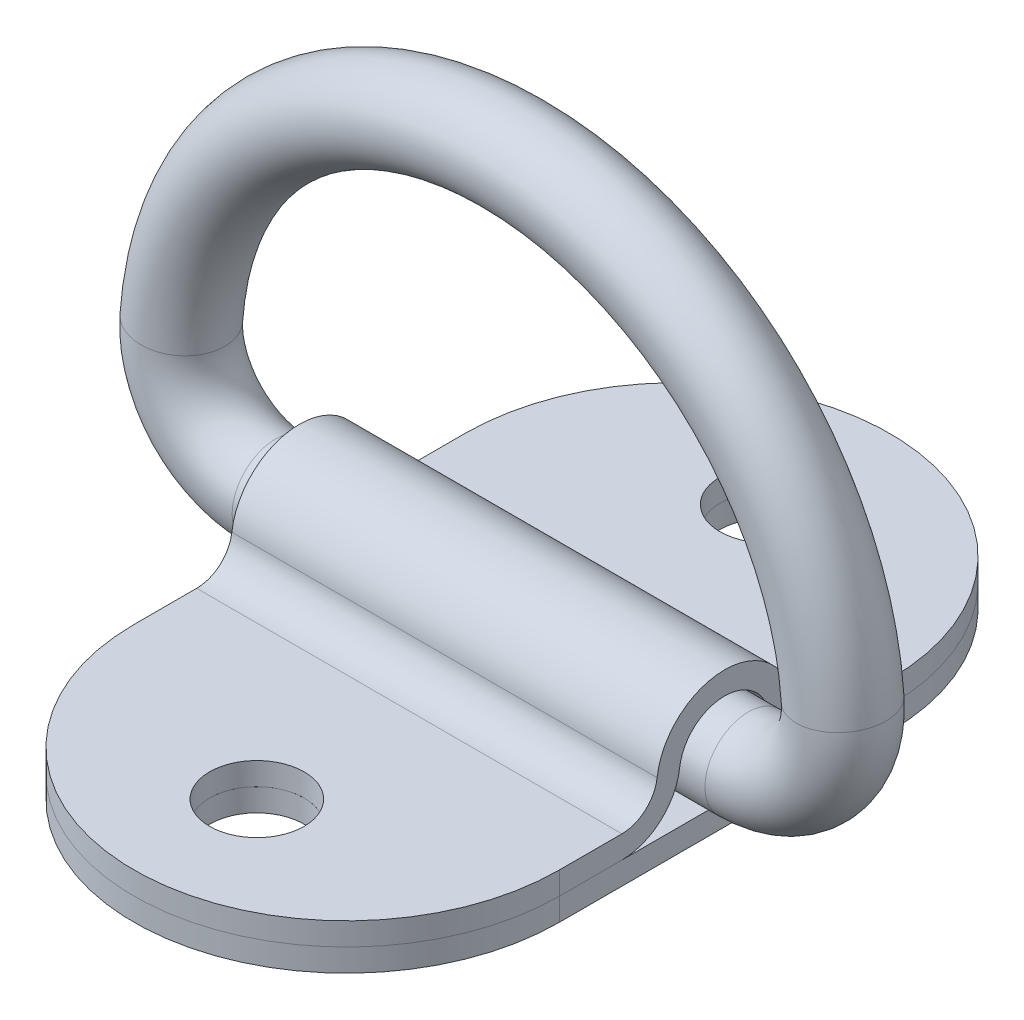
ISO-10303-21;
HEADER;
FILE_DESCRIPTION(('STEP AP214'),'2;1');
FILE_NAME('part.step','',(''),(''),'','','');
FILE_SCHEMA(('AUTOMOTIVE_DESIGN { 1 0 10303 214 1 1 1 1 }'));
ENDSEC;
DATA;
#1=APPLICATION_CONTEXT('core data for automotive mechanical design processes');
#2=APPLICATION_PROTOCOL_DEFINITION('international standard','automotive_design',2000,#1);
#3=PRODUCT_CONTEXT('',#1,'mechanical');
#4=PRODUCT('Part','Part','',(#3));
#5=PRODUCT_RELATED_PRODUCT_CATEGORY('part','',(#4));
#6=PRODUCT_DEFINITION_FORMATION('','',#4);
#7=PRODUCT_DEFINITION_CONTEXT('part definition',#1,'design');
#8=PRODUCT_DEFINITION('design','',#6,#7);
#9=PRODUCT_DEFINITION_SHAPE('','',#8);
#10=(LENGTH_UNIT() NAMED_UNIT(*) SI_UNIT(.MILLI.,.METRE.));
#11=(NAMED_UNIT(*) PLANE_ANGLE_UNIT() SI_UNIT($,.RADIAN.));
#12=(NAMED_UNIT(*) SI_UNIT($,.STERADIAN.) SOLID_ANGLE_UNIT());
#13=UNCERTAINTY_MEASURE_WITH_UNIT(LENGTH_MEASURE(1.E-05),#10,'distance_accuracy_value','');
#14=(GEOMETRIC_REPRESENTATION_CONTEXT(3) GLOBAL_UNCERTAINTY_ASSIGNED_CONTEXT((#13)) GLOBAL_UNIT_ASSIGNED_CONTEXT((#10,
#11,#12)) REPRESENTATION_CONTEXT('',''));
#15=CARTESIAN_POINT('',(0.,0.,0.));
#16=DIRECTION('',(0.,0.,1.));
#17=DIRECTION('',(1.,0.,0.));
#18=AXIS2_PLACEMENT_3D('',#15,#16,#17);
#19=CARTESIAN_POINT('',(-15.8836162119642,0.,0.));
#20=DIRECTION('',(1.,0.,0.));
#21=DIRECTION('',(0.,1.,0.));
#22=AXIS2_PLACEMENT_3D('',#19,#20,#21);
#23=CYLINDRICAL_SURFACE('',#22,2.921);
#24=CARTESIAN_POINT('',(0.,0.,0.));
#25=DIRECTION('',(1.,0.,0.));
#26=DIRECTION('',(0.,0.,-1.));
#27=AXIS2_PLACEMENT_3D('',#24,#25,#26);
#28=CIRCLE('',#27,2.921);
#29=CARTESIAN_POINT('',(0.,0.,-2.921));
#30=VERTEX_POINT('',#29);
#31=EDGE_CURVE('E88',#30,#30,#28,.T.);
#32=ORIENTED_EDGE('',*,*,#31,.F.);
#33=EDGE_LOOP('',(#32));
#34=FACE_BOUND('',#33,.T.);
#35=CARTESIAN_POINT('',(-15.8836162119642,0.,0.));
#36=DIRECTION('',(1.,0.,0.));
#37=DIRECTION('',(0.,0.,-1.));
#38=AXIS2_PLACEMENT_3D('',#35,#36,#37);
#39=CIRCLE('',#38,2.921);
#40=CARTESIAN_POINT('',(-15.8836162119642,-2.921,0.));
#41=VERTEX_POINT('',#40);
#42=EDGE_CURVE('E13',#41,#41,#39,.T.);
#43=ORIENTED_EDGE('',*,*,#42,.T.);
#44=EDGE_LOOP('',(#43));
#45=FACE_BOUND('',#44,.T.);
#46=ADVANCED_FACE('F56',(#34,#45),#23,.T.);
#47=CARTESIAN_POINT('',(-15.8836162119642,6.35,0.));
#48=DIRECTION('',(0.,0.,1.));
#49=DIRECTION('',(1.,0.,0.));
#50=AXIS2_PLACEMENT_3D('',#47,#48,#49);
#51=TOROIDAL_SURFACE('',#50,6.35,2.921);
#52=CARTESIAN_POINT('',(-22.2176602638823,6.79987325810833,0.));
#53=DIRECTION('',(-0.0708461823792653,-0.997487252270566,0.));
#54=DIRECTION('',(0.,0.,-1.));
#55=AXIS2_PLACEMENT_3D('',#52,#53,#54);
#56=CIRCLE('',#55,2.921);
#57=CARTESIAN_POINT('',(-25.1313205277647,7.00681495683817,0.));
#58=VERTEX_POINT('',#57);
#59=EDGE_CURVE('E65',#58,#58,#56,.T.);
#60=CARTESIAN_POINT('',(-15.8836162119642,6.35,0.));
#61=DIRECTION('',(0.,0.,1.));
#62=DIRECTION('',(1.,0.,0.));
#63=AXIS2_PLACEMENT_3D('',#60,#61,#62);
#64=CIRCLE('',#63,9.271);
#65=EDGE_CURVE('',#58,#41,#64,.T.);
#66=ORIENTED_EDGE('',*,*,#59,.T.);
#67=ORIENTED_EDGE('',*,*,#42,.F.);
#68=ORIENTED_EDGE('',*,*,#65,.T.);
#69=ORIENTED_EDGE('',*,*,#65,.F.);
#70=EDGE_LOOP('',(#66,#68,#67,#69));
#71=FACE_BOUND('',#70,.T.);
#72=ADVANCED_FACE('F96',(#71),#51,.T.);
#73=CARTESIAN_POINT('',(0.,5.22187172724906,0.));
#74=DIRECTION('',(0.,0.,1.));
#75=DIRECTION('',(1.,0.,0.));
#76=AXIS2_PLACEMENT_3D('',#73,#74,#75);
#77=TOROIDAL_SURFACE('',#76,22.2736282727509,2.921);
#78=CARTESIAN_POINT('',(22.2176602638823,6.79987325810831,0.));
#79=DIRECTION('',(-0.0708461823792641,0.997487252270566,0.));
#80=DIRECTION('',(0.,0.,-1.));
#81=AXIS2_PLACEMENT_3D('',#78,#79,#80);
#82=CIRCLE('',#81,2.921);
#83=CARTESIAN_POINT('',(25.1313205277646,7.00681495683814,0.));
#84=VERTEX_POINT('',#83);
#85=EDGE_CURVE('E72',#84,#84,#82,.T.);
#86=CARTESIAN_POINT('',(0.,5.22187172724906,0.));
#87=DIRECTION('',(0.,0.,1.));
#88=DIRECTION('',(1.,0.,0.));
#89=AXIS2_PLACEMENT_3D('',#86,#87,#88);
#90=CIRCLE('',#89,25.1946282727509);
#91=EDGE_CURVE('',#84,#58,#90,.T.);
#92=ORIENTED_EDGE('',*,*,#85,.T.);
#93=ORIENTED_EDGE('',*,*,#59,.F.);
#94=ORIENTED_EDGE('',*,*,#91,.T.);
#95=ORIENTED_EDGE('',*,*,#91,.F.);
#96=EDGE_LOOP('',(#92,#94,#93,#95));
#97=FACE_BOUND('',#96,.T.);
#98=ADVANCED_FACE('F100',(#97),#77,.T.);
#99=CARTESIAN_POINT('',(15.8836162119642,6.34999999999999,0.));
#100=DIRECTION('',(0.,0.,1.));
#101=DIRECTION('',(1.,0.,0.));
#102=AXIS2_PLACEMENT_3D('',#99,#100,#101);
#103=TOROIDAL_SURFACE('',#102,6.34999999999998,2.921);
#104=CARTESIAN_POINT('',(15.8836162119642,0.,0.));
#105=DIRECTION('',(1.,0.,0.));
#106=DIRECTION('',(0.,0.,-1.));
#107=AXIS2_PLACEMENT_3D('',#104,#105,#106);
#108=CIRCLE('',#107,2.921);
#109=CARTESIAN_POINT('',(15.8836162119642,-2.921,0.));
#110=VERTEX_POINT('',#109);
#111=EDGE_CURVE('E77',#110,#110,#108,.T.);
#112=CARTESIAN_POINT('',(15.8836162119642,6.34999999999999,0.));
#113=DIRECTION('',(0.,0.,1.));
#114=DIRECTION('',(1.,0.,0.));
#115=AXIS2_PLACEMENT_3D('',#112,#113,#114);
#116=CIRCLE('',#115,9.27099999999998);
#117=EDGE_CURVE('',#110,#84,#116,.T.);
#118=ORIENTED_EDGE('',*,*,#111,.T.);
#119=ORIENTED_EDGE('',*,*,#85,.F.);
#120=ORIENTED_EDGE('',*,*,#117,.T.);
#121=ORIENTED_EDGE('',*,*,#117,.F.);
#122=EDGE_LOOP('',(#118,#120,#119,#121));
#123=FACE_BOUND('',#122,.T.);
#124=ADVANCED_FACE('F105',(#123),#103,.T.);
#125=CARTESIAN_POINT('',(0.,0.,0.));
#126=DIRECTION('',(1.,0.,0.));
#127=DIRECTION('',(0.,1.,0.));
#128=AXIS2_PLACEMENT_3D('',#125,#126,#127);
#129=CYLINDRICAL_SURFACE('',#128,2.921);
#130=ORIENTED_EDGE('',*,*,#111,.F.);
#131=EDGE_LOOP('',(#130));
#132=FACE_BOUND('',#131,.T.);
#133=ORIENTED_EDGE('',*,*,#31,.T.);
#134=EDGE_LOOP('',(#133));
#135=FACE_BOUND('',#134,.T.);
#136=ADVANCED_FACE('F93',(#132,#135),#129,.T.);
#137=CLOSED_SHELL('',(#46,#72,#98,#124,#136));
#138=MANIFOLD_SOLID_BREP('B2',#137);
#139=CARTESIAN_POINT('',(14.2875,-4.57199999999999,25.4));
#140=DIRECTION('',(0.,1.,0.));
#141=DIRECTION('',(0.,0.,1.));
#142=AXIS2_PLACEMENT_3D('',#139,#140,#141);
#143=PLANE('',#142);
#144=CARTESIAN_POINT('',(0.,-4.57199999999999,17.145));
#145=DIRECTION('',(0.,1.,0.));
#146=DIRECTION('',(0.,0.,1.));
#147=AXIS2_PLACEMENT_3D('',#144,#145,#146);
#148=CIRCLE('',#147,3.175);
#149=CARTESIAN_POINT('',(0.,-4.57199999999999,20.32));
#150=VERTEX_POINT('',#149);
#151=EDGE_CURVE('E263',#150,#150,#148,.T.);
#152=ORIENTED_EDGE('',*,*,#151,.T.);
#153=EDGE_LOOP('',(#152));
#154=FACE_BOUND('',#153,.T.);
#155=CARTESIAN_POINT('',(0.,-4.57199999999999,-17.145));
#156=DIRECTION('',(0.,1.,0.));
#157=DIRECTION('',(0.,0.,1.));
#158=AXIS2_PLACEMENT_3D('',#155,#156,#157);
#159=CIRCLE('',#158,3.175);
#160=CARTESIAN_POINT('',(0.,-4.57199999999999,-13.97));
#161=VERTEX_POINT('',#160);
#162=EDGE_CURVE('E270',#161,#161,#159,.T.);
#163=ORIENTED_EDGE('',*,*,#162,.T.);
#164=EDGE_LOOP('',(#163));
#165=FACE_BOUND('',#164,.T.);
#166=CARTESIAN_POINT('',(0.,-4.57199999999999,11.1125));
#167=DIRECTION('',(0.,1.,0.));
#168=DIRECTION('',(0.,0.,1.));
#169=AXIS2_PLACEMENT_3D('',#166,#167,#168);
#170=CIRCLE('',#169,14.2875);
#171=CARTESIAN_POINT('',(-14.2875,-4.57199999999999,11.1125));
#172=VERTEX_POINT('',#171);
#173=CARTESIAN_POINT('',(14.2875,-4.57199999999999,11.1125));
#174=VERTEX_POINT('',#173);
#175=EDGE_CURVE('E219',#172,#174,#170,.T.);
#176=ORIENTED_EDGE('',*,*,#175,.F.);
#177=DIRECTION('',(0.,0.,-1.));
#178=VECTOR('',#177,1.);
#179=CARTESIAN_POINT('',(-14.2875,-4.57199999999999,25.4));
#180=LINE('',#179,#178);
#181=CARTESIAN_POINT('',(-14.2875,-4.57199999999999,-11.1125));
#182=VERTEX_POINT('',#181);
#183=EDGE_CURVE('E245',#172,#182,#180,.T.);
#184=ORIENTED_EDGE('',*,*,#183,.T.);
#185=CARTESIAN_POINT('',(0.,-4.57199999999999,-11.1125));
#186=DIRECTION('',(0.,1.,0.));
#187=DIRECTION('',(0.,0.,1.));
#188=AXIS2_PLACEMENT_3D('',#185,#186,#187);
#189=CIRCLE('',#188,14.2875);
#190=CARTESIAN_POINT('',(14.2875,-4.57199999999999,-11.1125));
#191=VERTEX_POINT('',#190);
#192=EDGE_CURVE('E190',#191,#182,#189,.T.);
#193=ORIENTED_EDGE('',*,*,#192,.F.);
#194=DIRECTION('',(0.,0.,-1.));
#195=VECTOR('',#194,1.);
#196=CARTESIAN_POINT('',(14.2875,-4.57199999999999,25.4));
#197=LINE('',#196,#195);
#198=EDGE_CURVE('E179',#174,#191,#197,.T.);
#199=ORIENTED_EDGE('',*,*,#198,.F.);
#200=EDGE_LOOP('',(#176,#184,#193,#199));
#201=FACE_BOUND('',#200,.T.);
#202=ADVANCED_FACE('F168',(#154,#165,#201),#143,.F.);
#203=CARTESIAN_POINT('',(14.2875,-3.048,25.4));
#204=DIRECTION('',(0.,-1.,0.));
#205=DIRECTION('',(0.,0.,-1.));
#206=AXIS2_PLACEMENT_3D('',#203,#204,#205);
#207=PLANE('',#206);
#208=CARTESIAN_POINT('',(0.,-3.048,17.145));
#209=DIRECTION('',(0.,-1.,0.));
#210=DIRECTION('',(0.,0.,-1.));
#211=AXIS2_PLACEMENT_3D('',#208,#209,#210);
#212=CIRCLE('',#211,3.175);
#213=CARTESIAN_POINT('',(0.,-3.048,13.97));
#214=VERTEX_POINT('',#213);
#215=EDGE_CURVE('E172',#214,#214,#212,.T.);
#216=ORIENTED_EDGE('',*,*,#215,.T.);
#217=EDGE_LOOP('',(#216));
#218=FACE_BOUND('',#217,.T.);
#219=CARTESIAN_POINT('',(0.,-3.048,-17.145));
#220=DIRECTION('',(0.,-1.,0.));
#221=DIRECTION('',(0.,0.,-1.));
#222=AXIS2_PLACEMENT_3D('',#219,#220,#221);
#223=CIRCLE('',#222,3.175);
#224=CARTESIAN_POINT('',(0.,-3.048,-20.32));
#225=VERTEX_POINT('',#224);
#226=EDGE_CURVE('E259',#225,#225,#223,.T.);
#227=ORIENTED_EDGE('',*,*,#226,.T.);
#228=EDGE_LOOP('',(#227));
#229=FACE_BOUND('',#228,.T.);
#230=CARTESIAN_POINT('',(0.,-3.048,11.1125));
#231=DIRECTION('',(0.,-1.,0.));
#232=DIRECTION('',(0.,0.,-1.));
#233=AXIS2_PLACEMENT_3D('',#230,#231,#232);
#234=CIRCLE('',#233,14.2875);
#235=CARTESIAN_POINT('',(14.2875,-3.048,11.1125));
#236=VERTEX_POINT('',#235);
#237=CARTESIAN_POINT('',(-14.2875,-3.048,11.1125));
#238=VERTEX_POINT('',#237);
#239=EDGE_CURVE('E200',#236,#238,#234,.T.);
#240=ORIENTED_EDGE('',*,*,#239,.F.);
#241=DIRECTION('',(0.,0.,1.));
#242=VECTOR('',#241,1.);
#243=CARTESIAN_POINT('',(14.2875,-3.048,25.4));
#244=LINE('',#243,#242);
#245=CARTESIAN_POINT('',(14.2875,-3.048,-11.1125));
#246=VERTEX_POINT('',#245);
#247=EDGE_CURVE('E54',#246,#236,#244,.T.);
#248=ORIENTED_EDGE('',*,*,#247,.F.);
#249=CARTESIAN_POINT('',(0.,-3.048,-11.1125));
#250=DIRECTION('',(0.,-1.,0.));
#251=DIRECTION('',(0.,0.,-1.));
#252=AXIS2_PLACEMENT_3D('',#249,#250,#251);
#253=CIRCLE('',#252,14.2875);
#254=CARTESIAN_POINT('',(-14.2875,-3.048,-11.1125));
#255=VERTEX_POINT('',#254);
#256=EDGE_CURVE('E286',#255,#246,#253,.T.);
#257=ORIENTED_EDGE('',*,*,#256,.F.);
#258=DIRECTION('',(0.,0.,1.));
#259=VECTOR('',#258,1.);
#260=CARTESIAN_POINT('',(-14.2875,-3.048,25.4));
#261=LINE('',#260,#259);
#262=EDGE_CURVE('E239',#255,#238,#261,.T.);
#263=ORIENTED_EDGE('',*,*,#262,.T.);
#264=EDGE_LOOP('',(#240,#248,#257,#263));
#265=FACE_BOUND('',#264,.T.);
#266=ADVANCED_FACE('F311',(#218,#229,#265),#207,.F.);
#267=CARTESIAN_POINT('',(14.2875,0.,0.));
#268=DIRECTION('',(-1.,0.,0.));
#269=DIRECTION('',(0.,0.,1.));
#270=AXIS2_PLACEMENT_3D('',#267,#268,#269);
#271=PLANE('',#270);
#272=DIRECTION('',(0.,1.,0.));
#273=VECTOR('',#272,1.);
#274=CARTESIAN_POINT('',(14.2875,-4.57199999999999,11.1125));
#275=LINE('',#274,#273);
#276=EDGE_CURVE('E222',#174,#236,#275,.T.);
#277=ORIENTED_EDGE('',*,*,#276,.F.);
#278=ORIENTED_EDGE('',*,*,#198,.T.);
#279=DIRECTION('',(0.,1.,0.));
#280=VECTOR('',#279,1.);
#281=CARTESIAN_POINT('',(14.2875,-4.57199999999999,-11.1125));
#282=LINE('',#281,#280);
#283=EDGE_CURVE('E236',#191,#246,#282,.T.);
#284=ORIENTED_EDGE('',*,*,#283,.T.);
#285=ORIENTED_EDGE('',*,*,#247,.T.);
#286=EDGE_LOOP('',(#277,#278,#284,#285));
#287=FACE_BOUND('',#286,.T.);
#288=ADVANCED_FACE('F232',(#287),#271,.F.);
#289=CARTESIAN_POINT('',(-14.2875,0.,0.));
#290=DIRECTION('',(-1.,0.,0.));
#291=DIRECTION('',(0.,0.,1.));
#292=AXIS2_PLACEMENT_3D('',#289,#290,#291);
#293=PLANE('',#292);
#294=ORIENTED_EDGE('',*,*,#183,.F.);
#295=DIRECTION('',(0.,1.,0.));
#296=VECTOR('',#295,1.);
#297=CARTESIAN_POINT('',(-14.2875,-4.57199999999999,11.1125));
#298=LINE('',#297,#296);
#299=EDGE_CURVE('E223',#172,#238,#298,.T.);
#300=ORIENTED_EDGE('',*,*,#299,.T.);
#301=ORIENTED_EDGE('',*,*,#262,.F.);
#302=DIRECTION('',(0.,1.,0.));
#303=VECTOR('',#302,1.);
#304=CARTESIAN_POINT('',(-14.2875,-4.57199999999999,-11.1125));
#305=LINE('',#304,#303);
#306=EDGE_CURVE('E287',#182,#255,#305,.T.);
#307=ORIENTED_EDGE('',*,*,#306,.F.);
#308=EDGE_LOOP('',(#294,#300,#301,#307));
#309=FACE_BOUND('',#308,.T.);
#310=ADVANCED_FACE('F306',(#309),#293,.T.);
#311=CARTESIAN_POINT('',(0.,-4.57199999999999,-11.1125));
#312=DIRECTION('',(0.,1.,0.));
#313=DIRECTION('',(0.,0.,1.));
#314=AXIS2_PLACEMENT_3D('',#311,#312,#313);
#315=CYLINDRICAL_SURFACE('',#314,14.2875);
#316=ORIENTED_EDGE('',*,*,#192,.T.);
#317=ORIENTED_EDGE('',*,*,#306,.T.);
#318=ORIENTED_EDGE('',*,*,#256,.T.);
#319=ORIENTED_EDGE('',*,*,#283,.F.);
#320=EDGE_LOOP('',(#316,#317,#318,#319));
#321=FACE_BOUND('',#320,.T.);
#322=ADVANCED_FACE('F309',(#321),#315,.T.);
#323=CARTESIAN_POINT('',(0.,-4.57199999999999,11.1125));
#324=DIRECTION('',(0.,1.,0.));
#325=DIRECTION('',(0.,0.,1.));
#326=AXIS2_PLACEMENT_3D('',#323,#324,#325);
#327=CYLINDRICAL_SURFACE('',#326,14.2875);
#328=ORIENTED_EDGE('',*,*,#299,.F.);
#329=ORIENTED_EDGE('',*,*,#175,.T.);
#330=ORIENTED_EDGE('',*,*,#276,.T.);
#331=ORIENTED_EDGE('',*,*,#239,.T.);
#332=EDGE_LOOP('',(#328,#329,#330,#331));
#333=FACE_BOUND('',#332,.T.);
#334=ADVANCED_FACE('F221',(#333),#327,.T.);
#335=CARTESIAN_POINT('',(0.,-4.57199999999999,-17.145));
#336=DIRECTION('',(0.,1.,0.));
#337=DIRECTION('',(0.,0.,1.));
#338=AXIS2_PLACEMENT_3D('',#335,#336,#337);
#339=CYLINDRICAL_SURFACE('',#338,3.175);
#340=ORIENTED_EDGE('',*,*,#162,.F.);
#341=EDGE_LOOP('',(#340));
#342=FACE_BOUND('',#341,.T.);
#343=ORIENTED_EDGE('',*,*,#226,.F.);
#344=EDGE_LOOP('',(#343));
#345=FACE_BOUND('',#344,.T.);
#346=ADVANCED_FACE('F331',(#342,#345),#339,.F.);
#347=CARTESIAN_POINT('',(0.,-4.57199999999999,17.145));
#348=DIRECTION('',(0.,1.,0.));
#349=DIRECTION('',(0.,0.,1.));
#350=AXIS2_PLACEMENT_3D('',#347,#348,#349);
#351=CYLINDRICAL_SURFACE('',#350,3.175);
#352=ORIENTED_EDGE('',*,*,#151,.F.);
#353=EDGE_LOOP('',(#352));
#354=FACE_BOUND('',#353,.T.);
#355=ORIENTED_EDGE('',*,*,#215,.F.);
#356=EDGE_LOOP('',(#355));
#357=FACE_BOUND('',#356,.T.);
#358=ADVANCED_FACE('F336',(#354,#357),#351,.F.);
#359=CLOSED_SHELL('',(#202,#266,#288,#310,#322,#334,#346,#358));
#360=MANIFOLD_SOLID_BREP('B8',#359);
#361=CARTESIAN_POINT('',(14.2875,-3.048,25.4));
#362=DIRECTION('',(0.,1.,0.));
#363=DIRECTION('',(0.,0.,1.));
#364=AXIS2_PLACEMENT_3D('',#361,#362,#363);
#365=PLANE('',#364);
#366=CARTESIAN_POINT('',(0.,-3.048,17.145));
#367=DIRECTION('',(0.,1.,0.));
#368=DIRECTION('',(0.,0.,1.));
#369=AXIS2_PLACEMENT_3D('',#366,#367,#368);
#370=CIRCLE('',#369,3.175);
#371=CARTESIAN_POINT('',(0.,-3.048,20.32));
#372=VERTEX_POINT('',#371);
#373=EDGE_CURVE('E599',#372,#372,#370,.T.);
#374=ORIENTED_EDGE('',*,*,#373,.T.);
#375=EDGE_LOOP('',(#374));
#376=FACE_BOUND('',#375,.T.);
#377=DIRECTION('',(0.,0.,-1.));
#378=VECTOR('',#377,1.);
#379=CARTESIAN_POINT('',(14.2875,-3.048,25.4));
#380=LINE('',#379,#378);
#381=CARTESIAN_POINT('',(14.2875,-3.048,11.1125));
#382=VERTEX_POINT('',#381);
#383=CARTESIAN_POINT('',(14.2875,-3.048,6.90020347526071));
#384=VERTEX_POINT('',#383);
#385=EDGE_CURVE('E730',#382,#384,#380,.T.);
#386=ORIENTED_EDGE('',*,*,#385,.F.);
#387=CARTESIAN_POINT('',(0.,-3.048,11.1125));
#388=DIRECTION('',(0.,1.,0.));
#389=DIRECTION('',(0.,0.,1.));
#390=AXIS2_PLACEMENT_3D('',#387,#388,#389);
#391=CIRCLE('',#390,14.2875);
#392=CARTESIAN_POINT('',(-14.2875,-3.048,11.1125));
#393=VERTEX_POINT('',#392);
#394=EDGE_CURVE('E657',#393,#382,#391,.T.);
#395=ORIENTED_EDGE('',*,*,#394,.F.);
#396=DIRECTION('',(0.,0.,-1.));
#397=VECTOR('',#396,1.);
#398=CARTESIAN_POINT('',(-14.2875,-3.048,25.4));
#399=LINE('',#398,#397);
#400=CARTESIAN_POINT('',(-14.2875,-3.048,6.90020347526071));
#401=VERTEX_POINT('',#400);
#402=EDGE_CURVE('E661',#393,#401,#399,.T.);
#403=ORIENTED_EDGE('',*,*,#402,.T.);
#404=DIRECTION('',(-1.,0.,0.));
#405=VECTOR('',#404,1.);
#406=CARTESIAN_POINT('',(14.2875,-3.048,6.90020347526071));
#407=LINE('',#406,#405);
#408=EDGE_CURVE('E526',#384,#401,#407,.T.);
#409=ORIENTED_EDGE('',*,*,#408,.F.);
#410=EDGE_LOOP('',(#386,#395,#403,#409));
#411=FACE_BOUND('',#410,.T.);
#412=ADVANCED_FACE('F405',(#376,#411),#365,.F.);
#413=CARTESIAN_POINT('',(14.2875,-3.048,-6.90020347526071));
#414=DIRECTION('',(0.,1.,0.));
#415=DIRECTION('',(0.,0.,1.));
#416=AXIS2_PLACEMENT_3D('',#413,#414,#415);
#417=PLANE('',#416);
#418=CARTESIAN_POINT('',(0.,-3.048,-17.145));
#419=DIRECTION('',(0.,1.,0.));
#420=DIRECTION('',(0.,0.,1.));
#421=AXIS2_PLACEMENT_3D('',#418,#419,#420);
#422=CIRCLE('',#421,3.175);
#423=CARTESIAN_POINT('',(0.,-3.048,-13.97));
#424=VERTEX_POINT('',#423);
#425=EDGE_CURVE('E592',#424,#424,#422,.T.);
#426=ORIENTED_EDGE('',*,*,#425,.T.);
#427=EDGE_LOOP('',(#426));
#428=FACE_BOUND('',#427,.T.);
#429=CARTESIAN_POINT('',(0.,-3.048,-11.1125));
#430=DIRECTION('',(0.,1.,0.));
#431=DIRECTION('',(0.,0.,1.));
#432=AXIS2_PLACEMENT_3D('',#429,#430,#431);
#433=CIRCLE('',#432,14.2875);
#434=CARTESIAN_POINT('',(14.2875,-3.048,-11.1125));
#435=VERTEX_POINT('',#434);
#436=CARTESIAN_POINT('',(-14.2875,-3.048,-11.1125));
#437=VERTEX_POINT('',#436);
#438=EDGE_CURVE('E426',#435,#437,#433,.T.);
#439=ORIENTED_EDGE('',*,*,#438,.F.);
#440=DIRECTION('',(0.,0.,-1.));
#441=VECTOR('',#440,1.);
#442=CARTESIAN_POINT('',(14.2875,-3.048,-6.90020347526071));
#443=LINE('',#442,#441);
#444=CARTESIAN_POINT('',(14.2875,-3.048,-6.90020347526071));
#445=VERTEX_POINT('',#444);
#446=EDGE_CURVE('E617',#445,#435,#443,.T.);
#447=ORIENTED_EDGE('',*,*,#446,.F.);
#448=DIRECTION('',(-1.,0.,0.));
#449=VECTOR('',#448,1.);
#450=CARTESIAN_POINT('',(14.2875,-3.048,-6.90020347526071));
#451=LINE('',#450,#449);
#452=CARTESIAN_POINT('',(-14.2875,-3.048,-6.90020347526071));
#453=VERTEX_POINT('',#452);
#454=EDGE_CURVE('E683',#445,#453,#451,.T.);
#455=ORIENTED_EDGE('',*,*,#454,.T.);
#456=DIRECTION('',(0.,0.,-1.));
#457=VECTOR('',#456,1.);
#458=CARTESIAN_POINT('',(-14.2875,-3.048,-6.90020347526071));
#459=LINE('',#458,#457);
#460=EDGE_CURVE('E543',#453,#437,#459,.T.);
#461=ORIENTED_EDGE('',*,*,#460,.T.);
#462=EDGE_LOOP('',(#439,#447,#455,#461));
#463=FACE_BOUND('',#462,.T.);
#464=ADVANCED_FACE('F689',(#428,#463),#417,.F.);
#465=CARTESIAN_POINT('',(14.2875,-1.524,-25.4));
#466=DIRECTION('',(0.,-1.,0.));
#467=DIRECTION('',(0.,0.,-1.));
#468=AXIS2_PLACEMENT_3D('',#465,#466,#467);
#469=PLANE('',#468);
#470=CARTESIAN_POINT('',(0.,-1.524,-17.145));
#471=DIRECTION('',(0.,-1.,0.));
#472=DIRECTION('',(0.,0.,-1.));
#473=AXIS2_PLACEMENT_3D('',#470,#471,#472);
#474=CIRCLE('',#473,3.175);
#475=CARTESIAN_POINT('',(0.,-1.524,-20.32));
#476=VERTEX_POINT('',#475);
#477=EDGE_CURVE('E409',#476,#476,#474,.T.);
#478=ORIENTED_EDGE('',*,*,#477,.T.);
#479=EDGE_LOOP('',(#478));
#480=FACE_BOUND('',#479,.T.);
#481=DIRECTION('',(0.,0.,1.));
#482=VECTOR('',#481,1.);
#483=CARTESIAN_POINT('',(14.2875,-1.524,-25.4));
#484=LINE('',#483,#482);
#485=CARTESIAN_POINT('',(14.2875,-1.524,-11.1125));
#486=VERTEX_POINT('',#485);
#487=CARTESIAN_POINT('',(14.2875,-1.524,-6.90020347526071));
#488=VERTEX_POINT('',#487);
#489=EDGE_CURVE('E534',#486,#488,#484,.T.);
#490=ORIENTED_EDGE('',*,*,#489,.F.);
#491=CARTESIAN_POINT('',(0.,-1.524,-11.1125));
#492=DIRECTION('',(0.,-1.,0.));
#493=DIRECTION('',(0.,0.,-1.));
#494=AXIS2_PLACEMENT_3D('',#491,#492,#493);
#495=CIRCLE('',#494,14.2875);
#496=CARTESIAN_POINT('',(-14.2875,-1.524,-11.1125));
#497=VERTEX_POINT('',#496);
#498=EDGE_CURVE('E519',#497,#486,#495,.T.);
#499=ORIENTED_EDGE('',*,*,#498,.F.);
#500=DIRECTION('',(0.,0.,1.));
#501=VECTOR('',#500,1.);
#502=CARTESIAN_POINT('',(-14.2875,-1.524,-25.4));
#503=LINE('',#502,#501);
#504=CARTESIAN_POINT('',(-14.2875,-1.524,-6.90020347526071));
#505=VERTEX_POINT('',#504);
#506=EDGE_CURVE('E532',#497,#505,#503,.T.);
#507=ORIENTED_EDGE('',*,*,#506,.T.);
#508=DIRECTION('',(-1.,0.,0.));
#509=VECTOR('',#508,1.);
#510=CARTESIAN_POINT('',(14.2875,-1.524,-6.90020347526071));
#511=LINE('',#510,#509);
#512=EDGE_CURVE('E692',#488,#505,#511,.T.);
#513=ORIENTED_EDGE('',*,*,#512,.F.);
#514=EDGE_LOOP('',(#490,#499,#507,#513));
#515=FACE_BOUND('',#514,.T.);
#516=ADVANCED_FACE('F530',(#480,#515),#469,.F.);
#517=CARTESIAN_POINT('',(14.2875,-1.524,25.4));
#518=DIRECTION('',(0.,-1.,0.));
#519=DIRECTION('',(0.,0.,-1.));
#520=AXIS2_PLACEMENT_3D('',#517,#518,#519);
#521=PLANE('',#520);
#522=CARTESIAN_POINT('',(0.,-1.524,17.145));
#523=DIRECTION('',(0.,-1.,0.));
#524=DIRECTION('',(0.,0.,-1.));
#525=AXIS2_PLACEMENT_3D('',#522,#523,#524);
#526=CIRCLE('',#525,3.175);
#527=CARTESIAN_POINT('',(0.,-1.524,13.97));
#528=VERTEX_POINT('',#527);
#529=EDGE_CURVE('E567',#528,#528,#526,.T.);
#530=ORIENTED_EDGE('',*,*,#529,.T.);
#531=EDGE_LOOP('',(#530));
#532=FACE_BOUND('',#531,.T.);
#533=CARTESIAN_POINT('',(0.,-1.524,11.1125));
#534=DIRECTION('',(0.,-1.,0.));
#535=DIRECTION('',(0.,0.,-1.));
#536=AXIS2_PLACEMENT_3D('',#533,#534,#535);
#537=CIRCLE('',#536,14.2875);
#538=CARTESIAN_POINT('',(14.2875,-1.524,11.1125));
#539=VERTEX_POINT('',#538);
#540=CARTESIAN_POINT('',(-14.2875,-1.524,11.1125));
#541=VERTEX_POINT('',#540);
#542=EDGE_CURVE('E437',#539,#541,#537,.T.);
#543=ORIENTED_EDGE('',*,*,#542,.F.);
#544=DIRECTION('',(0.,0.,1.));
#545=VECTOR('',#544,1.);
#546=CARTESIAN_POINT('',(14.2875,-1.524,25.4));
#547=LINE('',#546,#545);
#548=CARTESIAN_POINT('',(14.2875,-1.524,6.90020347526071));
#549=VERTEX_POINT('',#548);
#550=EDGE_CURVE('E635',#549,#539,#547,.T.);
#551=ORIENTED_EDGE('',*,*,#550,.F.);
#552=DIRECTION('',(-1.,0.,0.));
#553=VECTOR('',#552,1.);
#554=CARTESIAN_POINT('',(14.2875,-1.524,6.90020347526071));
#555=LINE('',#554,#553);
#556=CARTESIAN_POINT('',(-14.2875,-1.524,6.90020347526071));
#557=VERTEX_POINT('',#556);
#558=EDGE_CURVE('E640',#549,#557,#555,.T.);
#559=ORIENTED_EDGE('',*,*,#558,.T.);
#560=DIRECTION('',(0.,0.,1.));
#561=VECTOR('',#560,1.);
#562=CARTESIAN_POINT('',(-14.2875,-1.524,25.4));
#563=LINE('',#562,#561);
#564=EDGE_CURVE('E581',#557,#541,#563,.T.);
#565=ORIENTED_EDGE('',*,*,#564,.T.);
#566=EDGE_LOOP('',(#543,#551,#559,#565));
#567=FACE_BOUND('',#566,.T.);
#568=ADVANCED_FACE('F814',(#532,#567),#521,.F.);
#569=CARTESIAN_POINT('',(14.2875,0.85725,6.90020347526071));
#570=DIRECTION('',(1.,0.,0.));
#571=DIRECTION('',(0.,0.,-1.));
#572=AXIS2_PLACEMENT_3D('',#569,#570,#571);
#573=PLANE('',#572);
#574=CARTESIAN_POINT('',(14.2875,0.85725,-6.90020347526071));
#575=DIRECTION('',(1.,0.,0.));
#576=DIRECTION('',(0.,0.,-1.));
#577=AXIS2_PLACEMENT_3D('',#574,#575,#576);
#578=CIRCLE('',#577,3.90525);
#579=CARTESIAN_POINT('',(14.2875,0.375780821917809,-3.02474672888141));
#580=VERTEX_POINT('',#579);
#581=EDGE_CURVE('E743',#580,#445,#578,.T.);
#582=ORIENTED_EDGE('',*,*,#581,.T.);
#583=ORIENTED_EDGE('',*,*,#446,.T.);
#584=DIRECTION('',(0.,1.,0.));
#585=VECTOR('',#584,1.);
#586=CARTESIAN_POINT('',(14.2875,-4.57199999999999,-11.1125));
#587=LINE('',#586,#585);
#588=EDGE_CURVE('E536',#435,#486,#587,.T.);
#589=ORIENTED_EDGE('',*,*,#588,.T.);
#590=ORIENTED_EDGE('',*,*,#489,.T.);
#591=CARTESIAN_POINT('',(14.2875,0.85725,-6.90020347526071));
#592=DIRECTION('',(-1.,0.,0.));
#593=DIRECTION('',(0.,0.,-1.));
#594=AXIS2_PLACEMENT_3D('',#591,#592,#593);
#595=CIRCLE('',#594,2.38125);
#596=CARTESIAN_POINT('',(14.2875,0.563671232876713,-4.53712009332211));
#597=VERTEX_POINT('',#596);
#598=EDGE_CURVE('E616',#488,#597,#595,.T.);
#599=ORIENTED_EDGE('',*,*,#598,.T.);
#600=CARTESIAN_POINT('',(14.2875,0.,0.));
#601=DIRECTION('',(1.,0.,0.));
#602=DIRECTION('',(0.,0.,-1.));
#603=AXIS2_PLACEMENT_3D('',#600,#601,#602);
#604=CIRCLE('',#603,4.572);
#605=CARTESIAN_POINT('',(14.2875,0.563671232876712,4.53712009332211));
#606=VERTEX_POINT('',#605);
#607=EDGE_CURVE('E623',#597,#606,#604,.T.);
#608=ORIENTED_EDGE('',*,*,#607,.T.);
#609=CARTESIAN_POINT('',(14.2875,0.85725,6.90020347526071));
#610=DIRECTION('',(-1.,0.,0.));
#611=DIRECTION('',(0.,0.,-1.));
#612=AXIS2_PLACEMENT_3D('',#609,#610,#611);
#613=CIRCLE('',#612,2.38125);
#614=EDGE_CURVE('E627',#606,#549,#613,.T.);
#615=ORIENTED_EDGE('',*,*,#614,.T.);
#616=ORIENTED_EDGE('',*,*,#550,.T.);
#617=DIRECTION('',(0.,1.,0.));
#618=VECTOR('',#617,1.);
#619=CARTESIAN_POINT('',(14.2875,-4.57199999999999,11.1125));
#620=LINE('',#619,#618);
#621=EDGE_CURVE('E598',#382,#539,#620,.T.);
#622=ORIENTED_EDGE('',*,*,#621,.F.);
#623=ORIENTED_EDGE('',*,*,#385,.T.);
#624=CARTESIAN_POINT('',(14.2875,0.85725,6.90020347526071));
#625=DIRECTION('',(1.,0.,0.));
#626=DIRECTION('',(0.,0.,-1.));
#627=AXIS2_PLACEMENT_3D('',#624,#625,#626);
#628=CIRCLE('',#627,3.90525);
#629=CARTESIAN_POINT('',(14.2875,0.375780821917808,3.02474672888141));
#630=VERTEX_POINT('',#629);
#631=EDGE_CURVE('E723',#384,#630,#628,.T.);
#632=ORIENTED_EDGE('',*,*,#631,.T.);
#633=CARTESIAN_POINT('',(14.2875,0.,0.));
#634=DIRECTION('',(-1.,0.,0.));
#635=DIRECTION('',(0.,0.,-1.));
#636=AXIS2_PLACEMENT_3D('',#633,#634,#635);
#637=CIRCLE('',#636,3.048);
#638=EDGE_CURVE('E738',#630,#580,#637,.T.);
#639=ORIENTED_EDGE('',*,*,#638,.T.);
#640=EDGE_LOOP('',(#582,#583,#589,#590,#599,#608,#615,#616,#622,#623,#632,#639));
#641=FACE_BOUND('',#640,.T.);
#642=ADVANCED_FACE('F748',(#641),#573,.T.);
#643=CARTESIAN_POINT('',(-14.2875,0.85725,6.90020347526071));
#644=DIRECTION('',(1.,0.,0.));
#645=DIRECTION('',(0.,0.,-1.));
#646=AXIS2_PLACEMENT_3D('',#643,#644,#645);
#647=PLANE('',#646);
#648=CARTESIAN_POINT('',(-14.2875,0.,0.));
#649=DIRECTION('',(1.,0.,0.));
#650=DIRECTION('',(0.,0.,-1.));
#651=AXIS2_PLACEMENT_3D('',#648,#649,#650);
#652=CIRCLE('',#651,4.572);
#653=CARTESIAN_POINT('',(-14.2875,0.563671232876713,-4.53712009332211));
#654=VERTEX_POINT('',#653);
#655=CARTESIAN_POINT('',(-14.2875,0.563671232876712,4.53712009332211));
#656=VERTEX_POINT('',#655);
#657=EDGE_CURVE('E546',#654,#656,#652,.T.);
#658=ORIENTED_EDGE('',*,*,#657,.F.);
#659=CARTESIAN_POINT('',(-14.2875,0.85725,-6.90020347526071));
#660=DIRECTION('',(-1.,0.,0.));
#661=DIRECTION('',(0.,0.,-1.));
#662=AXIS2_PLACEMENT_3D('',#659,#660,#661);
#663=CIRCLE('',#662,2.38125);
#664=EDGE_CURVE('E541',#505,#654,#663,.T.);
#665=ORIENTED_EDGE('',*,*,#664,.F.);
#666=ORIENTED_EDGE('',*,*,#506,.F.);
#667=DIRECTION('',(0.,1.,0.));
#668=VECTOR('',#667,1.);
#669=CARTESIAN_POINT('',(-14.2875,-4.57199999999999,-11.1125));
#670=LINE('',#669,#668);
#671=EDGE_CURVE('E415',#437,#497,#670,.T.);
#672=ORIENTED_EDGE('',*,*,#671,.F.);
#673=ORIENTED_EDGE('',*,*,#460,.F.);
#674=CARTESIAN_POINT('',(-14.2875,0.85725,-6.90020347526071));
#675=DIRECTION('',(1.,0.,0.));
#676=DIRECTION('',(0.,0.,-1.));
#677=AXIS2_PLACEMENT_3D('',#674,#675,#676);
#678=CIRCLE('',#677,3.90525);
#679=CARTESIAN_POINT('',(-14.2875,0.375780821917809,-3.02474672888141));
#680=VERTEX_POINT('',#679);
#681=EDGE_CURVE('E549',#680,#453,#678,.T.);
#682=ORIENTED_EDGE('',*,*,#681,.F.);
#683=CARTESIAN_POINT('',(-14.2875,0.,0.));
#684=DIRECTION('',(-1.,0.,0.));
#685=DIRECTION('',(0.,0.,-1.));
#686=AXIS2_PLACEMENT_3D('',#683,#684,#685);
#687=CIRCLE('',#686,3.048);
#688=CARTESIAN_POINT('',(-14.2875,0.375780821917808,3.02474672888141));
#689=VERTEX_POINT('',#688);
#690=EDGE_CURVE('E671',#689,#680,#687,.T.);
#691=ORIENTED_EDGE('',*,*,#690,.F.);
#692=CARTESIAN_POINT('',(-14.2875,0.85725,6.90020347526071));
#693=DIRECTION('',(1.,0.,0.));
#694=DIRECTION('',(0.,0.,-1.));
#695=AXIS2_PLACEMENT_3D('',#692,#693,#694);
#696=CIRCLE('',#695,3.90525);
#697=EDGE_CURVE('E666',#401,#689,#696,.T.);
#698=ORIENTED_EDGE('',*,*,#697,.F.);
#699=ORIENTED_EDGE('',*,*,#402,.F.);
#700=DIRECTION('',(0.,1.,0.));
#701=VECTOR('',#700,1.);
#702=CARTESIAN_POINT('',(-14.2875,-4.57199999999999,11.1125));
#703=LINE('',#702,#701);
#704=EDGE_CURVE('E166',#393,#541,#703,.T.);
#705=ORIENTED_EDGE('',*,*,#704,.T.);
#706=ORIENTED_EDGE('',*,*,#564,.F.);
#707=CARTESIAN_POINT('',(-14.2875,0.85725,6.90020347526071));
#708=DIRECTION('',(-1.,0.,0.));
#709=DIRECTION('',(0.,0.,-1.));
#710=AXIS2_PLACEMENT_3D('',#707,#708,#709);
#711=CIRCLE('',#710,2.38125);
#712=EDGE_CURVE('E577',#656,#557,#711,.T.);
#713=ORIENTED_EDGE('',*,*,#712,.F.);
#714=EDGE_LOOP('',(#658,#665,#666,#672,#673,#682,#691,#698,#699,#705,#706,#713));
#715=FACE_BOUND('',#714,.T.);
#716=ADVANCED_FACE('F540',(#715),#647,.F.);
#717=CARTESIAN_POINT('',(14.2875,0.85725,6.90020347526071));
#718=DIRECTION('',(-1.,0.,0.));
#719=DIRECTION('',(0.,0.,1.));
#720=AXIS2_PLACEMENT_3D('',#717,#718,#719);
#721=CYLINDRICAL_SURFACE('',#720,3.90525);
#722=ORIENTED_EDGE('',*,*,#408,.T.);
#723=ORIENTED_EDGE('',*,*,#697,.T.);
#724=DIRECTION('',(-1.,0.,0.));
#725=VECTOR('',#724,1.);
#726=CARTESIAN_POINT('',(14.2875,0.375780821917808,3.02474672888141));
#727=LINE('',#726,#725);
#728=EDGE_CURVE('E695',#630,#689,#727,.T.);
#729=ORIENTED_EDGE('',*,*,#728,.F.);
#730=ORIENTED_EDGE('',*,*,#631,.F.);
#731=EDGE_LOOP('',(#722,#723,#729,#730));
#732=FACE_BOUND('',#731,.T.);
#733=ADVANCED_FACE('F722',(#732),#721,.T.);
#734=CARTESIAN_POINT('',(14.2875,0.,0.));
#735=DIRECTION('',(-1.,0.,0.));
#736=DIRECTION('',(0.,0.,1.));
#737=AXIS2_PLACEMENT_3D('',#734,#735,#736);
#738=CYLINDRICAL_SURFACE('',#737,3.048);
#739=ORIENTED_EDGE('',*,*,#728,.T.);
#740=ORIENTED_EDGE('',*,*,#690,.T.);
#741=DIRECTION('',(-1.,0.,0.));
#742=VECTOR('',#741,1.);
#743=CARTESIAN_POINT('',(14.2875,0.375780821917809,-3.02474672888141));
#744=LINE('',#743,#742);
#745=EDGE_CURVE('E686',#580,#680,#744,.T.);
#746=ORIENTED_EDGE('',*,*,#745,.F.);
#747=ORIENTED_EDGE('',*,*,#638,.F.);
#748=EDGE_LOOP('',(#739,#740,#746,#747));
#749=FACE_BOUND('',#748,.T.);
#750=ADVANCED_FACE('F749',(#749),#738,.F.);
#751=CARTESIAN_POINT('',(14.2875,0.85725,-6.90020347526071));
#752=DIRECTION('',(-1.,0.,0.));
#753=DIRECTION('',(0.,0.,1.));
#754=AXIS2_PLACEMENT_3D('',#751,#752,#753);
#755=CYLINDRICAL_SURFACE('',#754,3.90525);
#756=ORIENTED_EDGE('',*,*,#745,.T.);
#757=ORIENTED_EDGE('',*,*,#681,.T.);
#758=ORIENTED_EDGE('',*,*,#454,.F.);
#759=ORIENTED_EDGE('',*,*,#581,.F.);
#760=EDGE_LOOP('',(#756,#757,#758,#759));
#761=FACE_BOUND('',#760,.T.);
#762=ADVANCED_FACE('F681',(#761),#755,.T.);
#763=CARTESIAN_POINT('',(14.2875,0.85725,-6.90020347526071));
#764=DIRECTION('',(-1.,0.,0.));
#765=DIRECTION('',(0.,0.,1.));
#766=AXIS2_PLACEMENT_3D('',#763,#764,#765);
#767=CYLINDRICAL_SURFACE('',#766,2.38125);
#768=ORIENTED_EDGE('',*,*,#512,.T.);
#769=ORIENTED_EDGE('',*,*,#664,.T.);
#770=DIRECTION('',(-1.,0.,0.));
#771=VECTOR('',#770,1.);
#772=CARTESIAN_POINT('',(14.2875,0.563671232876713,-4.53712009332211));
#773=LINE('',#772,#771);
#774=EDGE_CURVE('E698',#597,#654,#773,.T.);
#775=ORIENTED_EDGE('',*,*,#774,.F.);
#776=ORIENTED_EDGE('',*,*,#598,.F.);
#777=EDGE_LOOP('',(#768,#769,#775,#776));
#778=FACE_BOUND('',#777,.T.);
#779=ADVANCED_FACE('F756',(#778),#767,.F.);
#780=CARTESIAN_POINT('',(14.2875,0.,0.));
#781=DIRECTION('',(-1.,0.,0.));
#782=DIRECTION('',(0.,0.,1.));
#783=AXIS2_PLACEMENT_3D('',#780,#781,#782);
#784=CYLINDRICAL_SURFACE('',#783,4.572);
#785=ORIENTED_EDGE('',*,*,#774,.T.);
#786=ORIENTED_EDGE('',*,*,#657,.T.);
#787=DIRECTION('',(-1.,0.,0.));
#788=VECTOR('',#787,1.);
#789=CARTESIAN_POINT('',(14.2875,0.563671232876712,4.53712009332211));
#790=LINE('',#789,#788);
#791=EDGE_CURVE('E645',#606,#656,#790,.T.);
#792=ORIENTED_EDGE('',*,*,#791,.F.);
#793=ORIENTED_EDGE('',*,*,#607,.F.);
#794=EDGE_LOOP('',(#785,#786,#792,#793));
#795=FACE_BOUND('',#794,.T.);
#796=ADVANCED_FACE('F820',(#795),#784,.T.);
#797=CARTESIAN_POINT('',(14.2875,0.85725,6.90020347526071));
#798=DIRECTION('',(-1.,0.,0.));
#799=DIRECTION('',(0.,0.,1.));
#800=AXIS2_PLACEMENT_3D('',#797,#798,#799);
#801=CYLINDRICAL_SURFACE('',#800,2.38125);
#802=ORIENTED_EDGE('',*,*,#791,.T.);
#803=ORIENTED_EDGE('',*,*,#712,.T.);
#804=ORIENTED_EDGE('',*,*,#558,.F.);
#805=ORIENTED_EDGE('',*,*,#614,.F.);
#806=EDGE_LOOP('',(#802,#803,#804,#805));
#807=FACE_BOUND('',#806,.T.);
#808=ADVANCED_FACE('F803',(#807),#801,.F.);
#809=CARTESIAN_POINT('',(0.,-4.57199999999999,-11.1125));
#810=DIRECTION('',(0.,1.,0.));
#811=DIRECTION('',(0.,0.,1.));
#812=AXIS2_PLACEMENT_3D('',#809,#810,#811);
#813=CYLINDRICAL_SURFACE('',#812,14.2875);
#814=ORIENTED_EDGE('',*,*,#438,.T.);
#815=ORIENTED_EDGE('',*,*,#671,.T.);
#816=ORIENTED_EDGE('',*,*,#498,.T.);
#817=ORIENTED_EDGE('',*,*,#588,.F.);
#818=EDGE_LOOP('',(#814,#815,#816,#817));
#819=FACE_BOUND('',#818,.T.);
#820=ADVANCED_FACE('F518',(#819),#813,.T.);
#821=CARTESIAN_POINT('',(0.,-4.57199999999999,11.1125));
#822=DIRECTION('',(0.,1.,0.));
#823=DIRECTION('',(0.,0.,1.));
#824=AXIS2_PLACEMENT_3D('',#821,#822,#823);
#825=CYLINDRICAL_SURFACE('',#824,14.2875);
#826=ORIENTED_EDGE('',*,*,#394,.T.);
#827=ORIENTED_EDGE('',*,*,#621,.T.);
#828=ORIENTED_EDGE('',*,*,#542,.T.);
#829=ORIENTED_EDGE('',*,*,#704,.F.);
#830=EDGE_LOOP('',(#826,#827,#828,#829));
#831=FACE_BOUND('',#830,.T.);
#832=ADVANCED_FACE('F769',(#831),#825,.T.);
#833=CARTESIAN_POINT('',(0.,-4.57199999999999,17.145));
#834=DIRECTION('',(0.,1.,0.));
#835=DIRECTION('',(0.,0.,1.));
#836=AXIS2_PLACEMENT_3D('',#833,#834,#835);
#837=CYLINDRICAL_SURFACE('',#836,3.175);
#838=ORIENTED_EDGE('',*,*,#529,.F.);
#839=EDGE_LOOP('',(#838));
#840=FACE_BOUND('',#839,.T.);
#841=ORIENTED_EDGE('',*,*,#373,.F.);
#842=EDGE_LOOP('',(#841));
#843=FACE_BOUND('',#842,.T.);
#844=ADVANCED_FACE('F785',(#840,#843),#837,.F.);
#845=CARTESIAN_POINT('',(0.,-4.57199999999999,-17.145));
#846=DIRECTION('',(0.,1.,0.));
#847=DIRECTION('',(0.,0.,1.));
#848=AXIS2_PLACEMENT_3D('',#845,#846,#847);
#849=CYLINDRICAL_SURFACE('',#848,3.175);
#850=ORIENTED_EDGE('',*,*,#477,.F.);
#851=EDGE_LOOP('',(#850));
#852=FACE_BOUND('',#851,.T.);
#853=ORIENTED_EDGE('',*,*,#425,.F.);
#854=EDGE_LOOP('',(#853));
#855=FACE_BOUND('',#854,.T.);
#856=ADVANCED_FACE('F782',(#852,#855),#849,.F.);
#857=CLOSED_SHELL('',(#412,#464,#516,#568,#642,#716,#733,#750,#762,#779,#796,#808,#820,#832,
#844,#856));
#858=MANIFOLD_SOLID_BREP('B48',#857);
#859=ADVANCED_BREP_SHAPE_REPRESENTATION('',(#18,#138,#360,#858),#14);
#860=SHAPE_DEFINITION_REPRESENTATION(#9,#859);
ENDSEC;
END-ISO-10303-21;
